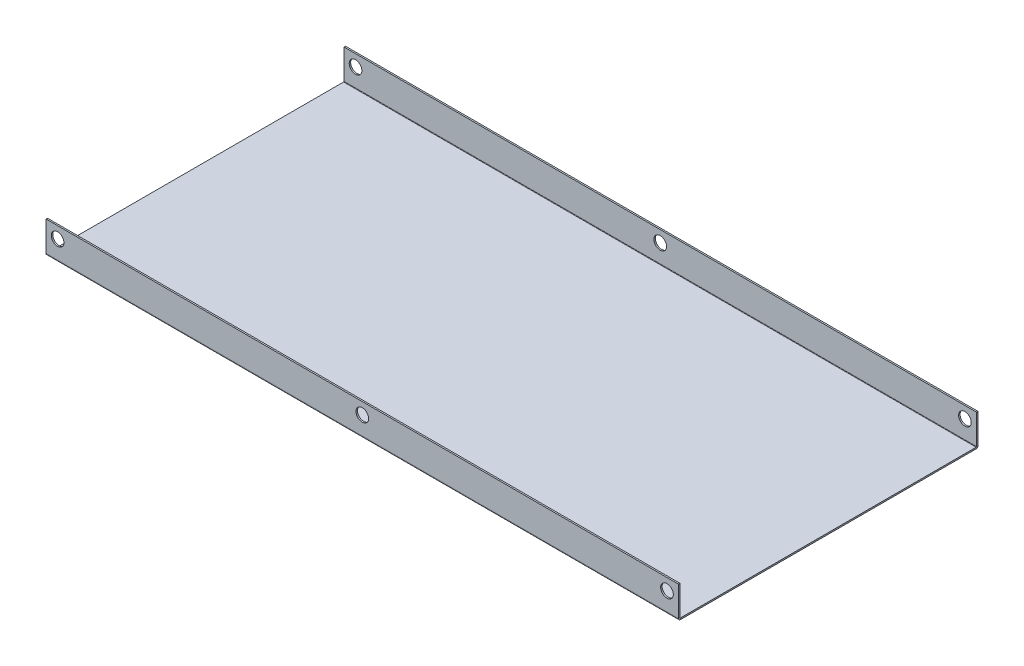
ISO-10303-21;
HEADER;
FILE_DESCRIPTION(('STEP AP214'),'2;1');
FILE_NAME('part.step','',(''),(''),'','','');
FILE_SCHEMA(('AUTOMOTIVE_DESIGN { 1 0 10303 214 1 1 1 1 }'));
ENDSEC;
DATA;
#1=APPLICATION_CONTEXT('core data for automotive mechanical design processes');
#2=APPLICATION_PROTOCOL_DEFINITION('international standard','automotive_design',2000,#1);
#3=PRODUCT_CONTEXT('',#1,'mechanical');
#4=PRODUCT('Part','Part','',(#3));
#5=PRODUCT_RELATED_PRODUCT_CATEGORY('part','',(#4));
#6=PRODUCT_DEFINITION_FORMATION('','',#4);
#7=PRODUCT_DEFINITION_CONTEXT('part definition',#1,'design');
#8=PRODUCT_DEFINITION('design','',#6,#7);
#9=PRODUCT_DEFINITION_SHAPE('','',#8);
#10=(LENGTH_UNIT() NAMED_UNIT(*) SI_UNIT(.MILLI.,.METRE.));
#11=(NAMED_UNIT(*) PLANE_ANGLE_UNIT() SI_UNIT($,.RADIAN.));
#12=(NAMED_UNIT(*) SI_UNIT($,.STERADIAN.) SOLID_ANGLE_UNIT());
#13=UNCERTAINTY_MEASURE_WITH_UNIT(LENGTH_MEASURE(1.E-05),#10,'distance_accuracy_value','');
#14=(GEOMETRIC_REPRESENTATION_CONTEXT(3) GLOBAL_UNCERTAINTY_ASSIGNED_CONTEXT((#13)) GLOBAL_UNIT_ASSIGNED_CONTEXT((#10,
#11,#12)) REPRESENTATION_CONTEXT('',''));
#15=CARTESIAN_POINT('',(0.,0.,0.));
#16=DIRECTION('',(0.,0.,1.));
#17=DIRECTION('',(1.,0.,0.));
#18=AXIS2_PLACEMENT_3D('',#15,#16,#17);
#19=CARTESIAN_POINT('',(0.,-0.7,0.));
#20=DIRECTION('',(0.,-1.,0.));
#21=DIRECTION('',(0.,0.,-1.));
#22=AXIS2_PLACEMENT_3D('',#19,#20,#21);
#23=PLANE('',#22);
#24=DIRECTION('',(0.,0.,-1.));
#25=VECTOR('',#24,1.);
#26=CARTESIAN_POINT('',(150.,-0.7,71.));
#27=LINE('',#26,#25);
#28=CARTESIAN_POINT('',(150.,-0.699999999999993,70.1));
#29=VERTEX_POINT('',#28);
#30=CARTESIAN_POINT('',(150.,-0.7,-70.1));
#31=VERTEX_POINT('',#30);
#32=EDGE_CURVE('E47',#29,#31,#27,.T.);
#33=ORIENTED_EDGE('',*,*,#32,.F.);
#34=DIRECTION('',(1.,0.,0.));
#35=VECTOR('',#34,1.);
#36=CARTESIAN_POINT('',(150.,-0.699999999999993,70.1));
#37=LINE('',#36,#35);
#38=CARTESIAN_POINT('',(-150.,-0.7,70.1));
#39=VERTEX_POINT('',#38);
#40=EDGE_CURVE('E172',#29,#39,#37,.F.);
#41=ORIENTED_EDGE('',*,*,#40,.T.);
#42=DIRECTION('',(0.,0.,1.));
#43=VECTOR('',#42,1.);
#44=CARTESIAN_POINT('',(-150.,-0.7,71.));
#45=LINE('',#44,#43);
#46=CARTESIAN_POINT('',(-150.,-0.700000000000018,-70.1));
#47=VERTEX_POINT('',#46);
#48=EDGE_CURVE('E11',#47,#39,#45,.T.);
#49=ORIENTED_EDGE('',*,*,#48,.F.);
#50=DIRECTION('',(-1.,0.,0.));
#51=VECTOR('',#50,1.);
#52=CARTESIAN_POINT('',(-150.,-0.700000000000018,-70.1));
#53=LINE('',#52,#51);
#54=EDGE_CURVE('E223',#47,#31,#53,.F.);
#55=ORIENTED_EDGE('',*,*,#54,.T.);
#56=EDGE_LOOP('',(#33,#41,#49,#55));
#57=FACE_BOUND('',#56,.T.);
#58=ADVANCED_FACE('F38',(#57),#23,.T.);
#59=CARTESIAN_POINT('',(0.,0.,0.));
#60=DIRECTION('',(0.,-1.,0.));
#61=DIRECTION('',(0.,0.,-1.));
#62=AXIS2_PLACEMENT_3D('',#59,#60,#61);
#63=PLANE('',#62);
#64=DIRECTION('',(1.,0.,0.));
#65=VECTOR('',#64,1.);
#66=CARTESIAN_POINT('',(150.,0.,70.1));
#67=LINE('',#66,#65);
#68=CARTESIAN_POINT('',(150.,0.,70.1));
#69=VERTEX_POINT('',#68);
#70=CARTESIAN_POINT('',(-150.,0.,70.1));
#71=VERTEX_POINT('',#70);
#72=EDGE_CURVE('E183',#69,#71,#67,.F.);
#73=ORIENTED_EDGE('',*,*,#72,.F.);
#74=DIRECTION('',(0.,0.,-1.));
#75=VECTOR('',#74,1.);
#76=CARTESIAN_POINT('',(150.,0.,71.));
#77=LINE('',#76,#75);
#78=CARTESIAN_POINT('',(150.,0.,-70.1));
#79=VERTEX_POINT('',#78);
#80=EDGE_CURVE('E240',#69,#79,#77,.T.);
#81=ORIENTED_EDGE('',*,*,#80,.T.);
#82=DIRECTION('',(-1.,0.,0.));
#83=VECTOR('',#82,1.);
#84=CARTESIAN_POINT('',(-150.,0.,-70.1));
#85=LINE('',#84,#83);
#86=CARTESIAN_POINT('',(-150.,0.,-70.1));
#87=VERTEX_POINT('',#86);
#88=EDGE_CURVE('E234',#87,#79,#85,.F.);
#89=ORIENTED_EDGE('',*,*,#88,.F.);
#90=DIRECTION('',(0.,0.,1.));
#91=VECTOR('',#90,1.);
#92=CARTESIAN_POINT('',(-150.,0.,71.));
#93=LINE('',#92,#91);
#94=EDGE_CURVE('E244',#87,#71,#93,.T.);
#95=ORIENTED_EDGE('',*,*,#94,.T.);
#96=EDGE_LOOP('',(#73,#81,#89,#95));
#97=FACE_BOUND('',#96,.T.);
#98=ADVANCED_FACE('F304',(#97),#63,.F.);
#99=CARTESIAN_POINT('',(150.,-0.7,71.));
#100=DIRECTION('',(1.,0.,0.));
#101=DIRECTION('',(0.,0.,-1.));
#102=AXIS2_PLACEMENT_3D('',#99,#100,#101);
#103=PLANE('',#102);
#104=ORIENTED_EDGE('',*,*,#80,.F.);
#105=DIRECTION('',(0.,-1.,0.));
#106=VECTOR('',#105,1.);
#107=CARTESIAN_POINT('',(150.,0.,70.1));
#108=LINE('',#107,#106);
#109=EDGE_CURVE('E177',#69,#29,#108,.T.);
#110=ORIENTED_EDGE('',*,*,#109,.T.);
#111=ORIENTED_EDGE('',*,*,#32,.T.);
#112=DIRECTION('',(0.,-1.,0.));
#113=VECTOR('',#112,1.);
#114=CARTESIAN_POINT('',(150.,0.,-70.1));
#115=LINE('',#114,#113);
#116=EDGE_CURVE('E238',#79,#31,#115,.T.);
#117=ORIENTED_EDGE('',*,*,#116,.F.);
#118=EDGE_LOOP('',(#104,#110,#111,#117));
#119=FACE_BOUND('',#118,.T.);
#120=ADVANCED_FACE('F40',(#119),#103,.T.);
#121=CARTESIAN_POINT('',(-150.,-0.7,71.));
#122=DIRECTION('',(-1.,0.,0.));
#123=DIRECTION('',(0.,0.,1.));
#124=AXIS2_PLACEMENT_3D('',#121,#122,#123);
#125=PLANE('',#124);
#126=DIRECTION('',(0.,-1.,0.));
#127=VECTOR('',#126,1.);
#128=CARTESIAN_POINT('',(-150.,0.,70.1));
#129=LINE('',#128,#127);
#130=EDGE_CURVE('E188',#71,#39,#129,.T.);
#131=ORIENTED_EDGE('',*,*,#130,.F.);
#132=ORIENTED_EDGE('',*,*,#94,.F.);
#133=DIRECTION('',(0.,-1.,0.));
#134=VECTOR('',#133,1.);
#135=CARTESIAN_POINT('',(-150.,0.,-70.1));
#136=LINE('',#135,#134);
#137=EDGE_CURVE('E228',#87,#47,#136,.T.);
#138=ORIENTED_EDGE('',*,*,#137,.T.);
#139=ORIENTED_EDGE('',*,*,#48,.T.);
#140=EDGE_LOOP('',(#131,#132,#138,#139));
#141=FACE_BOUND('',#140,.T.);
#142=ADVANCED_FACE('F316',(#141),#125,.T.);
#143=CARTESIAN_POINT('',(150.,0.200000000000008,-70.1));
#144=DIRECTION('',(1.,0.,0.));
#145=DIRECTION('',(0.,1.,0.));
#146=AXIS2_PLACEMENT_3D('',#143,#144,#145);
#147=PLANE('',#146);
#148=DIRECTION('',(0.,0.,1.));
#149=VECTOR('',#148,1.);
#150=CARTESIAN_POINT('',(150.,0.200000000000011,-71.));
#151=LINE('',#150,#149);
#152=CARTESIAN_POINT('',(150.,0.200000000000007,-70.3));
#153=VERTEX_POINT('',#152);
#154=CARTESIAN_POINT('',(150.,0.200000000000004,-71.));
#155=VERTEX_POINT('',#154);
#156=EDGE_CURVE('E190',#153,#155,#151,.F.);
#157=ORIENTED_EDGE('',*,*,#156,.F.);
#158=CARTESIAN_POINT('',(150.,0.200000000000008,-70.1));
#159=DIRECTION('',(-1.,0.,0.));
#160=DIRECTION('',(0.,-1.,0.));
#161=AXIS2_PLACEMENT_3D('',#158,#159,#160);
#162=CIRCLE('',#161,0.200000000000006);
#163=EDGE_CURVE('E231',#79,#153,#162,.F.);
#164=ORIENTED_EDGE('',*,*,#163,.F.);
#165=ORIENTED_EDGE('',*,*,#116,.T.);
#166=CARTESIAN_POINT('',(150.,0.200000000000008,-70.1));
#167=DIRECTION('',(-1.,0.,0.));
#168=DIRECTION('',(0.,-1.,0.));
#169=AXIS2_PLACEMENT_3D('',#166,#167,#168);
#170=CIRCLE('',#169,0.900000000000006);
#171=EDGE_CURVE('E55',#31,#155,#170,.F.);
#172=ORIENTED_EDGE('',*,*,#171,.T.);
#173=EDGE_LOOP('',(#157,#164,#165,#172));
#174=FACE_BOUND('',#173,.T.);
#175=ADVANCED_FACE('F318',(#174),#147,.T.);
#176=CARTESIAN_POINT('',(-150.,0.199999999999987,-70.1));
#177=DIRECTION('',(1.,0.,0.));
#178=DIRECTION('',(0.,1.,0.));
#179=AXIS2_PLACEMENT_3D('',#176,#177,#178);
#180=PLANE('',#179);
#181=CARTESIAN_POINT('',(-150.,0.199999999999987,-70.1));
#182=DIRECTION('',(-1.,0.,0.));
#183=DIRECTION('',(0.,-1.,0.));
#184=AXIS2_PLACEMENT_3D('',#181,#182,#183);
#185=CIRCLE('',#184,0.200000000000006);
#186=CARTESIAN_POINT('',(-150.,0.199999999999986,-70.3));
#187=VERTEX_POINT('',#186);
#188=EDGE_CURVE('E196',#187,#87,#185,.T.);
#189=ORIENTED_EDGE('',*,*,#188,.F.);
#190=DIRECTION('',(0.,0.,1.));
#191=VECTOR('',#190,1.);
#192=CARTESIAN_POINT('',(-150.,0.199999999999992,-70.3));
#193=LINE('',#192,#191);
#194=CARTESIAN_POINT('',(-150.,0.199999999999997,-71.));
#195=VERTEX_POINT('',#194);
#196=EDGE_CURVE('E216',#187,#195,#193,.F.);
#197=ORIENTED_EDGE('',*,*,#196,.T.);
#198=CARTESIAN_POINT('',(-150.,0.199999999999987,-70.1));
#199=DIRECTION('',(-1.,0.,0.));
#200=DIRECTION('',(0.,-1.,0.));
#201=AXIS2_PLACEMENT_3D('',#198,#199,#200);
#202=CIRCLE('',#201,0.900000000000006);
#203=EDGE_CURVE('E226',#195,#47,#202,.T.);
#204=ORIENTED_EDGE('',*,*,#203,.T.);
#205=ORIENTED_EDGE('',*,*,#137,.F.);
#206=EDGE_LOOP('',(#189,#197,#204,#205));
#207=FACE_BOUND('',#206,.T.);
#208=ADVANCED_FACE('F314',(#207),#180,.F.);
#209=CARTESIAN_POINT('',(-150.,0.199999999999987,-70.1));
#210=DIRECTION('',(-1.,0.,0.));
#211=DIRECTION('',(0.,0.,-1.));
#212=AXIS2_PLACEMENT_3D('',#209,#210,#211);
#213=CYLINDRICAL_SURFACE('',#212,0.900000000000006);
#214=ORIENTED_EDGE('',*,*,#54,.F.);
#215=ORIENTED_EDGE('',*,*,#203,.F.);
#216=DIRECTION('',(-1.,0.,0.));
#217=VECTOR('',#216,1.);
#218=CARTESIAN_POINT('',(150.,0.200000000000011,-71.));
#219=LINE('',#218,#217);
#220=EDGE_CURVE('E214',#195,#155,#219,.F.);
#221=ORIENTED_EDGE('',*,*,#220,.T.);
#222=ORIENTED_EDGE('',*,*,#171,.F.);
#223=EDGE_LOOP('',(#214,#215,#221,#222));
#224=FACE_BOUND('',#223,.T.);
#225=ADVANCED_FACE('F366',(#224),#213,.T.);
#226=CARTESIAN_POINT('',(-150.,0.199999999999987,-70.1));
#227=DIRECTION('',(-1.,0.,0.));
#228=DIRECTION('',(0.,0.,-1.));
#229=AXIS2_PLACEMENT_3D('',#226,#227,#228);
#230=CYLINDRICAL_SURFACE('',#229,0.200000000000006);
#231=ORIENTED_EDGE('',*,*,#88,.T.);
#232=ORIENTED_EDGE('',*,*,#163,.T.);
#233=DIRECTION('',(-1.,0.,0.));
#234=VECTOR('',#233,1.);
#235=CARTESIAN_POINT('',(150.,0.200000000000006,-70.3));
#236=LINE('',#235,#234);
#237=EDGE_CURVE('E219',#153,#187,#236,.T.);
#238=ORIENTED_EDGE('',*,*,#237,.T.);
#239=ORIENTED_EDGE('',*,*,#188,.T.);
#240=EDGE_LOOP('',(#231,#232,#238,#239));
#241=FACE_BOUND('',#240,.T.);
#242=ADVANCED_FACE('F335',(#241),#230,.F.);
#243=CARTESIAN_POINT('',(-150.,14.3,-71.));
#244=DIRECTION('',(1.,0.,0.));
#245=DIRECTION('',(0.,0.,-1.));
#246=AXIS2_PLACEMENT_3D('',#243,#244,#245);
#247=PLANE('',#246);
#248=ORIENTED_EDGE('',*,*,#196,.F.);
#249=DIRECTION('',(0.,-1.,0.));
#250=VECTOR('',#249,1.);
#251=CARTESIAN_POINT('',(-150.,14.3,-70.3));
#252=LINE('',#251,#250);
#253=CARTESIAN_POINT('',(-150.,14.3,-70.3));
#254=VERTEX_POINT('',#253);
#255=EDGE_CURVE('E212',#187,#254,#252,.F.);
#256=ORIENTED_EDGE('',*,*,#255,.T.);
#257=DIRECTION('',(0.,0.,1.));
#258=VECTOR('',#257,1.);
#259=CARTESIAN_POINT('',(-150.,14.3,-71.));
#260=LINE('',#259,#258);
#261=CARTESIAN_POINT('',(-150.,14.3,-71.));
#262=VERTEX_POINT('',#261);
#263=EDGE_CURVE('E193',#262,#254,#260,.T.);
#264=ORIENTED_EDGE('',*,*,#263,.F.);
#265=DIRECTION('',(0.,1.,0.));
#266=VECTOR('',#265,1.);
#267=CARTESIAN_POINT('',(-150.,-2.78058843749729E-13,-71.));
#268=LINE('',#267,#266);
#269=EDGE_CURVE('E205',#195,#262,#268,.T.);
#270=ORIENTED_EDGE('',*,*,#269,.F.);
#271=EDGE_LOOP('',(#248,#256,#264,#270));
#272=FACE_BOUND('',#271,.T.);
#273=ADVANCED_FACE('F358',(#272),#247,.F.);
#274=CARTESIAN_POINT('',(150.,0.,-71.));
#275=DIRECTION('',(-1.,0.,0.));
#276=DIRECTION('',(0.,0.,1.));
#277=AXIS2_PLACEMENT_3D('',#274,#275,#276);
#278=PLANE('',#277);
#279=ORIENTED_EDGE('',*,*,#156,.T.);
#280=DIRECTION('',(0.,-1.,0.));
#281=VECTOR('',#280,1.);
#282=CARTESIAN_POINT('',(150.,-2.78058843749729E-13,-71.));
#283=LINE('',#282,#281);
#284=CARTESIAN_POINT('',(150.,14.3,-71.));
#285=VERTEX_POINT('',#284);
#286=EDGE_CURVE('E200',#285,#155,#283,.T.);
#287=ORIENTED_EDGE('',*,*,#286,.F.);
#288=DIRECTION('',(0.,0.,1.));
#289=VECTOR('',#288,1.);
#290=CARTESIAN_POINT('',(150.,14.3,-71.));
#291=LINE('',#290,#289);
#292=CARTESIAN_POINT('',(150.,14.3,-70.3));
#293=VERTEX_POINT('',#292);
#294=EDGE_CURVE('E197',#285,#293,#291,.T.);
#295=ORIENTED_EDGE('',*,*,#294,.T.);
#296=DIRECTION('',(0.,1.,0.));
#297=VECTOR('',#296,1.);
#298=CARTESIAN_POINT('',(150.,0.,-70.3));
#299=LINE('',#298,#297);
#300=EDGE_CURVE('E207',#293,#153,#299,.F.);
#301=ORIENTED_EDGE('',*,*,#300,.T.);
#302=EDGE_LOOP('',(#279,#287,#295,#301));
#303=FACE_BOUND('',#302,.T.);
#304=ADVANCED_FACE('F340',(#303),#278,.F.);
#305=CARTESIAN_POINT('',(0.,-2.78058843749729E-13,-71.));
#306=DIRECTION('',(0.,0.,1.));
#307=DIRECTION('',(0.,-1.,0.));
#308=AXIS2_PLACEMENT_3D('',#305,#306,#307);
#309=PLANE('',#308);
#310=CARTESIAN_POINT('',(144.5,8.8,-71.));
#311=DIRECTION('',(0.,0.,-1.));
#312=DIRECTION('',(0.,1.,0.));
#313=AXIS2_PLACEMENT_3D('',#310,#311,#312);
#314=CIRCLE('',#313,2.99999999999999);
#315=CARTESIAN_POINT('',(144.5,11.8,-71.));
#316=VERTEX_POINT('',#315);
#317=EDGE_CURVE('E254',#316,#316,#314,.T.);
#318=ORIENTED_EDGE('',*,*,#317,.F.);
#319=EDGE_LOOP('',(#318));
#320=FACE_BOUND('',#319,.T.);
#321=CARTESIAN_POINT('',(0.,8.80000000000001,-71.));
#322=DIRECTION('',(0.,0.,-1.));
#323=DIRECTION('',(0.,1.,0.));
#324=AXIS2_PLACEMENT_3D('',#321,#322,#323);
#325=CIRCLE('',#324,3.);
#326=CARTESIAN_POINT('',(0.,11.8,-71.));
#327=VERTEX_POINT('',#326);
#328=EDGE_CURVE('E271',#327,#327,#325,.T.);
#329=ORIENTED_EDGE('',*,*,#328,.F.);
#330=EDGE_LOOP('',(#329));
#331=FACE_BOUND('',#330,.T.);
#332=CARTESIAN_POINT('',(-144.5,8.80000000000003,-71.));
#333=DIRECTION('',(0.,0.,-1.));
#334=DIRECTION('',(0.,-1.,0.));
#335=AXIS2_PLACEMENT_3D('',#332,#333,#334);
#336=CIRCLE('',#335,2.99999999999999);
#337=CARTESIAN_POINT('',(-144.5,5.80000000000004,-71.));
#338=VERTEX_POINT('',#337);
#339=EDGE_CURVE('E267',#338,#338,#336,.T.);
#340=ORIENTED_EDGE('',*,*,#339,.F.);
#341=EDGE_LOOP('',(#340));
#342=FACE_BOUND('',#341,.T.);
#343=ORIENTED_EDGE('',*,*,#220,.F.);
#344=ORIENTED_EDGE('',*,*,#269,.T.);
#345=DIRECTION('',(1.,0.,0.));
#346=VECTOR('',#345,1.);
#347=CARTESIAN_POINT('',(0.,14.3,-71.));
#348=LINE('',#347,#346);
#349=EDGE_CURVE('E203',#262,#285,#348,.T.);
#350=ORIENTED_EDGE('',*,*,#349,.T.);
#351=ORIENTED_EDGE('',*,*,#286,.T.);
#352=EDGE_LOOP('',(#343,#344,#350,#351));
#353=FACE_BOUND('',#352,.T.);
#354=ADVANCED_FACE('F344',(#320,#331,#342,#353),#309,.F.);
#355=CARTESIAN_POINT('',(0.,-2.75614806812539E-13,-70.3));
#356=DIRECTION('',(0.,0.,1.));
#357=DIRECTION('',(0.,-1.,0.));
#358=AXIS2_PLACEMENT_3D('',#355,#356,#357);
#359=PLANE('',#358);
#360=CARTESIAN_POINT('',(144.5,8.8,-70.3));
#361=DIRECTION('',(0.,0.,1.));
#362=DIRECTION('',(0.,-1.,0.));
#363=AXIS2_PLACEMENT_3D('',#360,#361,#362);
#364=CIRCLE('',#363,2.99999999999999);
#365=CARTESIAN_POINT('',(144.5,5.80000000000001,-70.3));
#366=VERTEX_POINT('',#365);
#367=EDGE_CURVE('E171',#366,#366,#364,.T.);
#368=ORIENTED_EDGE('',*,*,#367,.F.);
#369=EDGE_LOOP('',(#368));
#370=FACE_BOUND('',#369,.T.);
#371=CARTESIAN_POINT('',(0.,8.80000000000001,-70.3));
#372=DIRECTION('',(0.,0.,1.));
#373=DIRECTION('',(0.,-1.,0.));
#374=AXIS2_PLACEMENT_3D('',#371,#372,#373);
#375=CIRCLE('',#374,3.);
#376=CARTESIAN_POINT('',(0.,5.80000000000001,-70.3));
#377=VERTEX_POINT('',#376);
#378=EDGE_CURVE('E253',#377,#377,#375,.T.);
#379=ORIENTED_EDGE('',*,*,#378,.F.);
#380=EDGE_LOOP('',(#379));
#381=FACE_BOUND('',#380,.T.);
#382=CARTESIAN_POINT('',(-144.5,8.80000000000004,-70.3));
#383=DIRECTION('',(0.,0.,1.));
#384=DIRECTION('',(0.,-1.,0.));
#385=AXIS2_PLACEMENT_3D('',#382,#383,#384);
#386=CIRCLE('',#385,2.99999999999999);
#387=CARTESIAN_POINT('',(-144.5,5.80000000000004,-70.3));
#388=VERTEX_POINT('',#387);
#389=EDGE_CURVE('E250',#388,#388,#386,.T.);
#390=ORIENTED_EDGE('',*,*,#389,.F.);
#391=EDGE_LOOP('',(#390));
#392=FACE_BOUND('',#391,.T.);
#393=ORIENTED_EDGE('',*,*,#255,.F.);
#394=ORIENTED_EDGE('',*,*,#237,.F.);
#395=ORIENTED_EDGE('',*,*,#300,.F.);
#396=DIRECTION('',(-1.,0.,0.));
#397=VECTOR('',#396,1.);
#398=CARTESIAN_POINT('',(150.,14.3,-70.3));
#399=LINE('',#398,#397);
#400=EDGE_CURVE('E210',#254,#293,#399,.F.);
#401=ORIENTED_EDGE('',*,*,#400,.F.);
#402=EDGE_LOOP('',(#393,#394,#395,#401));
#403=FACE_BOUND('',#402,.T.);
#404=ADVANCED_FACE('F354',(#370,#381,#392,#403),#359,.T.);
#405=CARTESIAN_POINT('',(150.,14.3,-71.));
#406=DIRECTION('',(0.,-1.,0.));
#407=DIRECTION('',(0.,0.,-1.));
#408=AXIS2_PLACEMENT_3D('',#405,#406,#407);
#409=PLANE('',#408);
#410=ORIENTED_EDGE('',*,*,#400,.T.);
#411=ORIENTED_EDGE('',*,*,#294,.F.);
#412=ORIENTED_EDGE('',*,*,#349,.F.);
#413=ORIENTED_EDGE('',*,*,#263,.T.);
#414=EDGE_LOOP('',(#410,#411,#412,#413));
#415=FACE_BOUND('',#414,.T.);
#416=ADVANCED_FACE('F350',(#415),#409,.F.);
#417=CARTESIAN_POINT('',(-150.,0.200000000000013,70.1));
#418=DIRECTION('',(-1.,0.,0.));
#419=DIRECTION('',(0.,0.,1.));
#420=AXIS2_PLACEMENT_3D('',#417,#418,#419);
#421=PLANE('',#420);
#422=DIRECTION('',(0.,0.,-1.));
#423=VECTOR('',#422,1.);
#424=CARTESIAN_POINT('',(-150.,0.200000000000006,71.));
#425=LINE('',#424,#423);
#426=CARTESIAN_POINT('',(-150.,0.200000000000013,70.3));
#427=VERTEX_POINT('',#426);
#428=CARTESIAN_POINT('',(-150.,0.200000000000013,71.));
#429=VERTEX_POINT('',#428);
#430=EDGE_CURVE('E153',#427,#429,#425,.F.);
#431=ORIENTED_EDGE('',*,*,#430,.F.);
#432=CARTESIAN_POINT('',(-150.,0.200000000000013,70.1));
#433=DIRECTION('',(1.,0.,0.));
#434=DIRECTION('',(0.,0.,-1.));
#435=AXIS2_PLACEMENT_3D('',#432,#433,#434);
#436=CIRCLE('',#435,0.200000000000006);
#437=EDGE_CURVE('E180',#71,#427,#436,.F.);
#438=ORIENTED_EDGE('',*,*,#437,.F.);
#439=ORIENTED_EDGE('',*,*,#130,.T.);
#440=CARTESIAN_POINT('',(-150.,0.200000000000013,70.1));
#441=DIRECTION('',(1.,0.,0.));
#442=DIRECTION('',(0.,0.,-1.));
#443=AXIS2_PLACEMENT_3D('',#440,#441,#442);
#444=CIRCLE('',#443,0.900000000000006);
#445=EDGE_CURVE('E63',#39,#429,#444,.F.);
#446=ORIENTED_EDGE('',*,*,#445,.T.);
#447=EDGE_LOOP('',(#431,#438,#439,#446));
#448=FACE_BOUND('',#447,.T.);
#449=ADVANCED_FACE('F374',(#448),#421,.T.);
#450=CARTESIAN_POINT('',(150.,0.200000000000013,70.1));
#451=DIRECTION('',(-1.,0.,0.));
#452=DIRECTION('',(0.,0.,1.));
#453=AXIS2_PLACEMENT_3D('',#450,#451,#452);
#454=PLANE('',#453);
#455=CARTESIAN_POINT('',(150.,0.200000000000013,70.1));
#456=DIRECTION('',(1.,0.,0.));
#457=DIRECTION('',(0.,0.,-1.));
#458=AXIS2_PLACEMENT_3D('',#455,#456,#457);
#459=CIRCLE('',#458,0.200000000000006);
#460=CARTESIAN_POINT('',(150.,0.200000000000013,70.3));
#461=VERTEX_POINT('',#460);
#462=EDGE_CURVE('E185',#461,#69,#459,.T.);
#463=ORIENTED_EDGE('',*,*,#462,.F.);
#464=DIRECTION('',(0.,0.,-1.));
#465=VECTOR('',#464,1.);
#466=CARTESIAN_POINT('',(150.,0.20000000000002,70.3));
#467=LINE('',#466,#465);
#468=CARTESIAN_POINT('',(150.,0.20000000000002,71.));
#469=VERTEX_POINT('',#468);
#470=EDGE_CURVE('E165',#461,#469,#467,.F.);
#471=ORIENTED_EDGE('',*,*,#470,.T.);
#472=CARTESIAN_POINT('',(150.,0.200000000000013,70.1));
#473=DIRECTION('',(1.,0.,0.));
#474=DIRECTION('',(0.,0.,-1.));
#475=AXIS2_PLACEMENT_3D('',#472,#473,#474);
#476=CIRCLE('',#475,0.900000000000006);
#477=EDGE_CURVE('E175',#469,#29,#476,.T.);
#478=ORIENTED_EDGE('',*,*,#477,.T.);
#479=ORIENTED_EDGE('',*,*,#109,.F.);
#480=EDGE_LOOP('',(#463,#471,#478,#479));
#481=FACE_BOUND('',#480,.T.);
#482=ADVANCED_FACE('F290',(#481),#454,.F.);
#483=CARTESIAN_POINT('',(150.,0.200000000000013,70.1));
#484=DIRECTION('',(1.,0.,0.));
#485=DIRECTION('',(0.,0.,1.));
#486=AXIS2_PLACEMENT_3D('',#483,#484,#485);
#487=CYLINDRICAL_SURFACE('',#486,0.900000000000006);
#488=ORIENTED_EDGE('',*,*,#40,.F.);
#489=ORIENTED_EDGE('',*,*,#477,.F.);
#490=DIRECTION('',(1.,0.,0.));
#491=VECTOR('',#490,1.);
#492=CARTESIAN_POINT('',(-150.,0.200000000000006,71.));
#493=LINE('',#492,#491);
#494=EDGE_CURVE('E163',#469,#429,#493,.F.);
#495=ORIENTED_EDGE('',*,*,#494,.T.);
#496=ORIENTED_EDGE('',*,*,#445,.F.);
#497=EDGE_LOOP('',(#488,#489,#495,#496));
#498=FACE_BOUND('',#497,.T.);
#499=ADVANCED_FACE('F299',(#498),#487,.T.);
#500=CARTESIAN_POINT('',(150.,0.200000000000013,70.1));
#501=DIRECTION('',(1.,0.,0.));
#502=DIRECTION('',(0.,0.,1.));
#503=AXIS2_PLACEMENT_3D('',#500,#501,#502);
#504=CYLINDRICAL_SURFACE('',#503,0.200000000000006);
#505=ORIENTED_EDGE('',*,*,#72,.T.);
#506=ORIENTED_EDGE('',*,*,#437,.T.);
#507=DIRECTION('',(1.,0.,0.));
#508=VECTOR('',#507,1.);
#509=CARTESIAN_POINT('',(-150.,0.200000000000006,70.3));
#510=LINE('',#509,#508);
#511=EDGE_CURVE('E168',#427,#461,#510,.T.);
#512=ORIENTED_EDGE('',*,*,#511,.T.);
#513=ORIENTED_EDGE('',*,*,#462,.T.);
#514=EDGE_LOOP('',(#505,#506,#512,#513));
#515=FACE_BOUND('',#514,.T.);
#516=ADVANCED_FACE('F285',(#515),#504,.F.);
#517=CARTESIAN_POINT('',(150.,14.3,71.));
#518=DIRECTION('',(-1.,0.,0.));
#519=DIRECTION('',(0.,0.,1.));
#520=AXIS2_PLACEMENT_3D('',#517,#518,#519);
#521=PLANE('',#520);
#522=ORIENTED_EDGE('',*,*,#470,.F.);
#523=DIRECTION('',(0.,-1.,0.));
#524=VECTOR('',#523,1.);
#525=CARTESIAN_POINT('',(150.,14.3,70.3));
#526=LINE('',#525,#524);
#527=CARTESIAN_POINT('',(150.,14.3,70.3));
#528=VERTEX_POINT('',#527);
#529=EDGE_CURVE('E161',#461,#528,#526,.F.);
#530=ORIENTED_EDGE('',*,*,#529,.T.);
#531=DIRECTION('',(0.,0.,-1.));
#532=VECTOR('',#531,1.);
#533=CARTESIAN_POINT('',(150.,14.3,71.));
#534=LINE('',#533,#532);
#535=CARTESIAN_POINT('',(150.,14.3,71.));
#536=VERTEX_POINT('',#535);
#537=EDGE_CURVE('E149',#536,#528,#534,.T.);
#538=ORIENTED_EDGE('',*,*,#537,.F.);
#539=DIRECTION('',(0.,1.,0.));
#540=VECTOR('',#539,1.);
#541=CARTESIAN_POINT('',(150.,0.,71.));
#542=LINE('',#541,#540);
#543=EDGE_CURVE('E136',#469,#536,#542,.T.);
#544=ORIENTED_EDGE('',*,*,#543,.F.);
#545=EDGE_LOOP('',(#522,#530,#538,#544));
#546=FACE_BOUND('',#545,.T.);
#547=ADVANCED_FACE('F291',(#546),#521,.F.);
#548=CARTESIAN_POINT('',(-150.,0.,71.));
#549=DIRECTION('',(1.,0.,0.));
#550=DIRECTION('',(0.,0.,-1.));
#551=AXIS2_PLACEMENT_3D('',#548,#549,#550);
#552=PLANE('',#551);
#553=ORIENTED_EDGE('',*,*,#430,.T.);
#554=DIRECTION('',(0.,-1.,0.));
#555=VECTOR('',#554,1.);
#556=CARTESIAN_POINT('',(-150.,0.,71.));
#557=LINE('',#556,#555);
#558=CARTESIAN_POINT('',(-150.,14.3,71.));
#559=VERTEX_POINT('',#558);
#560=EDGE_CURVE('E134',#559,#429,#557,.T.);
#561=ORIENTED_EDGE('',*,*,#560,.F.);
#562=DIRECTION('',(0.,0.,-1.));
#563=VECTOR('',#562,1.);
#564=CARTESIAN_POINT('',(-150.,14.3,71.));
#565=LINE('',#564,#563);
#566=CARTESIAN_POINT('',(-150.,14.3,70.3));
#567=VERTEX_POINT('',#566);
#568=EDGE_CURVE('E142',#559,#567,#565,.T.);
#569=ORIENTED_EDGE('',*,*,#568,.T.);
#570=DIRECTION('',(0.,1.,0.));
#571=VECTOR('',#570,1.);
#572=CARTESIAN_POINT('',(-150.,0.,70.3));
#573=LINE('',#572,#571);
#574=EDGE_CURVE('E158',#567,#427,#573,.F.);
#575=ORIENTED_EDGE('',*,*,#574,.T.);
#576=EDGE_LOOP('',(#553,#561,#569,#575));
#577=FACE_BOUND('',#576,.T.);
#578=ADVANCED_FACE('F152',(#577),#552,.F.);
#579=CARTESIAN_POINT('',(0.,0.,71.));
#580=DIRECTION('',(0.,0.,-1.));
#581=DIRECTION('',(-1.,0.,0.));
#582=AXIS2_PLACEMENT_3D('',#579,#580,#581);
#583=PLANE('',#582);
#584=CARTESIAN_POINT('',(-144.5,8.8,71.));
#585=DIRECTION('',(0.,0.,1.));
#586=DIRECTION('',(1.,0.,0.));
#587=AXIS2_PLACEMENT_3D('',#584,#585,#586);
#588=CIRCLE('',#587,2.99999999999999);
#589=CARTESIAN_POINT('',(-141.5,8.8,71.));
#590=VERTEX_POINT('',#589);
#591=EDGE_CURVE('E262',#590,#590,#588,.T.);
#592=ORIENTED_EDGE('',*,*,#591,.F.);
#593=EDGE_LOOP('',(#592));
#594=FACE_BOUND('',#593,.T.);
#595=CARTESIAN_POINT('',(0.,8.80000000000001,71.));
#596=DIRECTION('',(0.,0.,1.));
#597=DIRECTION('',(1.,0.,0.));
#598=AXIS2_PLACEMENT_3D('',#595,#596,#597);
#599=CIRCLE('',#598,3.);
#600=CARTESIAN_POINT('',(3.,8.80000000000001,71.));
#601=VERTEX_POINT('',#600);
#602=EDGE_CURVE('E429',#601,#601,#599,.T.);
#603=ORIENTED_EDGE('',*,*,#602,.F.);
#604=EDGE_LOOP('',(#603));
#605=FACE_BOUND('',#604,.T.);
#606=CARTESIAN_POINT('',(144.5,8.80000000000004,71.));
#607=DIRECTION('',(0.,0.,1.));
#608=DIRECTION('',(-1.,0.,0.));
#609=AXIS2_PLACEMENT_3D('',#606,#607,#608);
#610=CIRCLE('',#609,2.99999999999999);
#611=CARTESIAN_POINT('',(141.5,8.80000000000004,71.));
#612=VERTEX_POINT('',#611);
#613=EDGE_CURVE('E427',#612,#612,#610,.T.);
#614=ORIENTED_EDGE('',*,*,#613,.F.);
#615=EDGE_LOOP('',(#614));
#616=FACE_BOUND('',#615,.T.);
#617=ORIENTED_EDGE('',*,*,#494,.F.);
#618=ORIENTED_EDGE('',*,*,#543,.T.);
#619=DIRECTION('',(-1.,0.,0.));
#620=VECTOR('',#619,1.);
#621=CARTESIAN_POINT('',(0.,14.3,71.));
#622=LINE('',#621,#620);
#623=EDGE_CURVE('E129',#536,#559,#622,.T.);
#624=ORIENTED_EDGE('',*,*,#623,.T.);
#625=ORIENTED_EDGE('',*,*,#560,.T.);
#626=EDGE_LOOP('',(#617,#618,#624,#625));
#627=FACE_BOUND('',#626,.T.);
#628=ADVANCED_FACE('F132',(#594,#605,#616,#627),#583,.F.);
#629=CARTESIAN_POINT('',(0.,0.,70.3));
#630=DIRECTION('',(0.,0.,-1.));
#631=DIRECTION('',(-1.,0.,0.));
#632=AXIS2_PLACEMENT_3D('',#629,#630,#631);
#633=PLANE('',#632);
#634=CARTESIAN_POINT('',(-144.5,8.8,70.3));
#635=DIRECTION('',(0.,0.,-1.));
#636=DIRECTION('',(-1.,0.,0.));
#637=AXIS2_PLACEMENT_3D('',#634,#635,#636);
#638=CIRCLE('',#637,2.99999999999999);
#639=CARTESIAN_POINT('',(-147.5,8.8,70.3));
#640=VERTEX_POINT('',#639);
#641=EDGE_CURVE('E42',#640,#640,#638,.T.);
#642=ORIENTED_EDGE('',*,*,#641,.F.);
#643=EDGE_LOOP('',(#642));
#644=FACE_BOUND('',#643,.T.);
#645=CARTESIAN_POINT('',(0.,8.80000000000001,70.3));
#646=DIRECTION('',(0.,0.,-1.));
#647=DIRECTION('',(-1.,0.,0.));
#648=AXIS2_PLACEMENT_3D('',#645,#646,#647);
#649=CIRCLE('',#648,3.);
#650=CARTESIAN_POINT('',(-3.,8.80000000000001,70.3));
#651=VERTEX_POINT('',#650);
#652=EDGE_CURVE('E261',#651,#651,#649,.T.);
#653=ORIENTED_EDGE('',*,*,#652,.F.);
#654=EDGE_LOOP('',(#653));
#655=FACE_BOUND('',#654,.T.);
#656=CARTESIAN_POINT('',(144.5,8.80000000000004,70.3));
#657=DIRECTION('',(0.,0.,-1.));
#658=DIRECTION('',(-1.,0.,0.));
#659=AXIS2_PLACEMENT_3D('',#656,#657,#658);
#660=CIRCLE('',#659,2.99999999999999);
#661=CARTESIAN_POINT('',(141.5,8.80000000000004,70.3));
#662=VERTEX_POINT('',#661);
#663=EDGE_CURVE('E259',#662,#662,#660,.T.);
#664=ORIENTED_EDGE('',*,*,#663,.F.);
#665=EDGE_LOOP('',(#664));
#666=FACE_BOUND('',#665,.T.);
#667=ORIENTED_EDGE('',*,*,#529,.F.);
#668=ORIENTED_EDGE('',*,*,#511,.F.);
#669=ORIENTED_EDGE('',*,*,#574,.F.);
#670=DIRECTION('',(1.,0.,0.));
#671=VECTOR('',#670,1.);
#672=CARTESIAN_POINT('',(-150.,14.3,70.3));
#673=LINE('',#672,#671);
#674=EDGE_CURVE('E145',#528,#567,#673,.F.);
#675=ORIENTED_EDGE('',*,*,#674,.F.);
#676=EDGE_LOOP('',(#667,#668,#669,#675));
#677=FACE_BOUND('',#676,.T.);
#678=ADVANCED_FACE('F281',(#644,#655,#666,#677),#633,.T.);
#679=CARTESIAN_POINT('',(-150.,14.3,71.));
#680=DIRECTION('',(0.,-1.,0.));
#681=DIRECTION('',(0.,0.,-1.));
#682=AXIS2_PLACEMENT_3D('',#679,#680,#681);
#683=PLANE('',#682);
#684=ORIENTED_EDGE('',*,*,#674,.T.);
#685=ORIENTED_EDGE('',*,*,#568,.F.);
#686=ORIENTED_EDGE('',*,*,#623,.F.);
#687=ORIENTED_EDGE('',*,*,#537,.T.);
#688=EDGE_LOOP('',(#684,#685,#686,#687));
#689=FACE_BOUND('',#688,.T.);
#690=ADVANCED_FACE('F143',(#689),#683,.F.);
#691=CARTESIAN_POINT('',(-144.5,8.80000000000007,-61.));
#692=DIRECTION('',(0.,0.,-1.));
#693=DIRECTION('',(0.,1.,0.));
#694=AXIS2_PLACEMENT_3D('',#691,#692,#693);
#695=CYLINDRICAL_SURFACE('',#694,2.99999999999999);
#696=ORIENTED_EDGE('',*,*,#389,.T.);
#697=EDGE_LOOP('',(#696));
#698=FACE_BOUND('',#697,.T.);
#699=ORIENTED_EDGE('',*,*,#339,.T.);
#700=EDGE_LOOP('',(#699));
#701=FACE_BOUND('',#700,.T.);
#702=ADVANCED_FACE('F396',(#698,#701),#695,.F.);
#703=CARTESIAN_POINT('',(0.,8.80000000000004,-61.));
#704=DIRECTION('',(0.,0.,-1.));
#705=DIRECTION('',(0.,1.,0.));
#706=AXIS2_PLACEMENT_3D('',#703,#704,#705);
#707=CYLINDRICAL_SURFACE('',#706,3.);
#708=ORIENTED_EDGE('',*,*,#378,.T.);
#709=EDGE_LOOP('',(#708));
#710=FACE_BOUND('',#709,.T.);
#711=ORIENTED_EDGE('',*,*,#328,.T.);
#712=EDGE_LOOP('',(#711));
#713=FACE_BOUND('',#712,.T.);
#714=ADVANCED_FACE('F398',(#710,#713),#707,.F.);
#715=CARTESIAN_POINT('',(144.5,8.80000000000004,-61.));
#716=DIRECTION('',(0.,0.,-1.));
#717=DIRECTION('',(0.,1.,0.));
#718=AXIS2_PLACEMENT_3D('',#715,#716,#717);
#719=CYLINDRICAL_SURFACE('',#718,2.99999999999999);
#720=ORIENTED_EDGE('',*,*,#367,.T.);
#721=EDGE_LOOP('',(#720));
#722=FACE_BOUND('',#721,.T.);
#723=ORIENTED_EDGE('',*,*,#317,.T.);
#724=EDGE_LOOP('',(#723));
#725=FACE_BOUND('',#724,.T.);
#726=ADVANCED_FACE('F404',(#722,#725),#719,.F.);
#727=CARTESIAN_POINT('',(144.5,8.80000000000004,61.));
#728=DIRECTION('',(0.,0.,1.));
#729=DIRECTION('',(1.,0.,0.));
#730=AXIS2_PLACEMENT_3D('',#727,#728,#729);
#731=CYLINDRICAL_SURFACE('',#730,2.99999999999999);
#732=ORIENTED_EDGE('',*,*,#663,.T.);
#733=EDGE_LOOP('',(#732));
#734=FACE_BOUND('',#733,.T.);
#735=ORIENTED_EDGE('',*,*,#613,.T.);
#736=EDGE_LOOP('',(#735));
#737=FACE_BOUND('',#736,.T.);
#738=ADVANCED_FACE('F420',(#734,#737),#731,.F.);
#739=CARTESIAN_POINT('',(0.,8.80000000000001,61.));
#740=DIRECTION('',(0.,0.,1.));
#741=DIRECTION('',(1.,0.,0.));
#742=AXIS2_PLACEMENT_3D('',#739,#740,#741);
#743=CYLINDRICAL_SURFACE('',#742,3.);
#744=ORIENTED_EDGE('',*,*,#652,.T.);
#745=EDGE_LOOP('',(#744));
#746=FACE_BOUND('',#745,.T.);
#747=ORIENTED_EDGE('',*,*,#602,.T.);
#748=EDGE_LOOP('',(#747));
#749=FACE_BOUND('',#748,.T.);
#750=ADVANCED_FACE('F423',(#746,#749),#743,.F.);
#751=CARTESIAN_POINT('',(-144.5,8.8,61.));
#752=DIRECTION('',(0.,0.,1.));
#753=DIRECTION('',(1.,0.,0.));
#754=AXIS2_PLACEMENT_3D('',#751,#752,#753);
#755=CYLINDRICAL_SURFACE('',#754,2.99999999999999);
#756=ORIENTED_EDGE('',*,*,#641,.T.);
#757=EDGE_LOOP('',(#756));
#758=FACE_BOUND('',#757,.T.);
#759=ORIENTED_EDGE('',*,*,#591,.T.);
#760=EDGE_LOOP('',(#759));
#761=FACE_BOUND('',#760,.T.);
#762=ADVANCED_FACE('F448',(#758,#761),#755,.F.);
#763=CLOSED_SHELL('',(#58,#98,#120,#142,#175,#208,#225,#242,#273,#304,#354,#404,#416,#449,#482,
#499,#516,#547,#578,#628,#678,#690,#702,#714,#726,#738,#750,#762));
#764=MANIFOLD_SOLID_BREP('B2',#763);
#765=ADVANCED_BREP_SHAPE_REPRESENTATION('',(#18,#764),#14);
#766=SHAPE_DEFINITION_REPRESENTATION(#9,#765);
ENDSEC;
END-ISO-10303-21;
